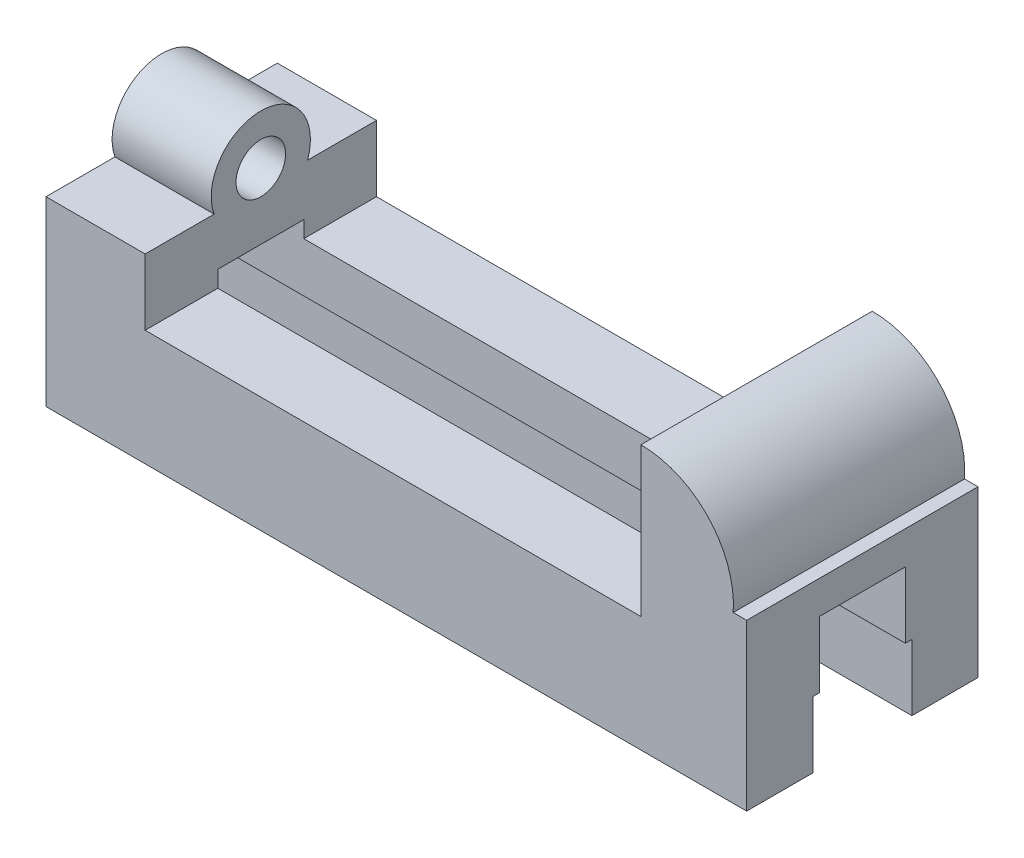
ISO-10303-21;
HEADER;
FILE_DESCRIPTION(('STEP AP214'),'2;1');
FILE_NAME('part.step','',(''),(''),'','','');
FILE_SCHEMA(('AUTOMOTIVE_DESIGN { 1 0 10303 214 1 1 1 1 }'));
ENDSEC;
DATA;
#1=APPLICATION_CONTEXT('core data for automotive mechanical design processes');
#2=APPLICATION_PROTOCOL_DEFINITION('international standard','automotive_design',2000,#1);
#3=PRODUCT_CONTEXT('',#1,'mechanical');
#4=PRODUCT('Part','Part','',(#3));
#5=PRODUCT_RELATED_PRODUCT_CATEGORY('part','',(#4));
#6=PRODUCT_DEFINITION_FORMATION('','',#4);
#7=PRODUCT_DEFINITION_CONTEXT('part definition',#1,'design');
#8=PRODUCT_DEFINITION('design','',#6,#7);
#9=PRODUCT_DEFINITION_SHAPE('','',#8);
#10=(LENGTH_UNIT() NAMED_UNIT(*) SI_UNIT(.MILLI.,.METRE.));
#11=(NAMED_UNIT(*) PLANE_ANGLE_UNIT() SI_UNIT($,.RADIAN.));
#12=(NAMED_UNIT(*) SI_UNIT($,.STERADIAN.) SOLID_ANGLE_UNIT());
#13=UNCERTAINTY_MEASURE_WITH_UNIT(LENGTH_MEASURE(1.E-05),#10,'distance_accuracy_value','');
#14=(GEOMETRIC_REPRESENTATION_CONTEXT(3) GLOBAL_UNCERTAINTY_ASSIGNED_CONTEXT((#13)) GLOBAL_UNIT_ASSIGNED_CONTEXT((#10,
#11,#12)) REPRESENTATION_CONTEXT('',''));
#15=CARTESIAN_POINT('',(0.,0.,0.));
#16=DIRECTION('',(0.,0.,1.));
#17=DIRECTION('',(1.,0.,0.));
#18=AXIS2_PLACEMENT_3D('',#15,#16,#17);
#19=CARTESIAN_POINT('',(-212.,40.,-15.));
#20=DIRECTION('',(1.,0.,0.));
#21=DIRECTION('',(0.,0.,-1.));
#22=AXIS2_PLACEMENT_3D('',#19,#20,#21);
#23=PLANE('',#22);
#24=DIRECTION('',(0.,0.,-1.));
#25=VECTOR('',#24,1.);
#26=CARTESIAN_POINT('',(-212.,-20.,-50.));
#27=LINE('',#26,#25);
#28=CARTESIAN_POINT('',(-212.,-20.,-30.));
#29=VERTEX_POINT('',#28);
#30=CARTESIAN_POINT('',(-212.,-20.,-50.));
#31=VERTEX_POINT('',#30);
#32=EDGE_CURVE('E334',#29,#31,#27,.T.);
#33=ORIENTED_EDGE('',*,*,#32,.F.);
#34=DIRECTION('',(0.,-1.,0.));
#35=VECTOR('',#34,1.);
#36=CARTESIAN_POINT('',(-212.,0.,-30.));
#37=LINE('',#36,#35);
#38=CARTESIAN_POINT('',(-212.,0.,-30.));
#39=VERTEX_POINT('',#38);
#40=EDGE_CURVE('E233',#39,#29,#37,.T.);
#41=ORIENTED_EDGE('',*,*,#40,.F.);
#42=DIRECTION('',(0.,0.,-1.));
#43=VECTOR('',#42,1.);
#44=CARTESIAN_POINT('',(-212.,0.,-28.));
#45=LINE('',#44,#43);
#46=CARTESIAN_POINT('',(-212.,0.,-28.));
#47=VERTEX_POINT('',#46);
#48=EDGE_CURVE('E229',#47,#39,#45,.T.);
#49=ORIENTED_EDGE('',*,*,#48,.F.);
#50=DIRECTION('',(0.,1.,0.));
#51=VECTOR('',#50,1.);
#52=CARTESIAN_POINT('',(-212.,-20.,-28.));
#53=LINE('',#52,#51);
#54=CARTESIAN_POINT('',(-212.,20.,-28.));
#55=VERTEX_POINT('',#54);
#56=EDGE_CURVE('E340',#47,#55,#53,.T.);
#57=ORIENTED_EDGE('',*,*,#56,.T.);
#58=DIRECTION('',(0.,0.,1.));
#59=VECTOR('',#58,1.);
#60=CARTESIAN_POINT('',(-212.,20.,-2.));
#61=LINE('',#60,#59);
#62=CARTESIAN_POINT('',(-212.,20.,-2.));
#63=VERTEX_POINT('',#62);
#64=EDGE_CURVE('E358',#55,#63,#61,.T.);
#65=ORIENTED_EDGE('',*,*,#64,.T.);
#66=DIRECTION('',(0.,-1.,0.));
#67=VECTOR('',#66,1.);
#68=CARTESIAN_POINT('',(-212.,15.,-2.));
#69=LINE('',#68,#67);
#70=CARTESIAN_POINT('',(-212.,0.,-2.));
#71=VERTEX_POINT('',#70);
#72=EDGE_CURVE('E360',#63,#71,#69,.T.);
#73=ORIENTED_EDGE('',*,*,#72,.T.);
#74=DIRECTION('',(0.,0.,-1.));
#75=VECTOR('',#74,1.);
#76=CARTESIAN_POINT('',(-212.,0.,-2.));
#77=LINE('',#76,#75);
#78=CARTESIAN_POINT('',(-212.,0.,0.));
#79=VERTEX_POINT('',#78);
#80=EDGE_CURVE('E250',#79,#71,#77,.T.);
#81=ORIENTED_EDGE('',*,*,#80,.F.);
#82=DIRECTION('',(0.,1.,0.));
#83=VECTOR('',#82,1.);
#84=CARTESIAN_POINT('',(-212.,-20.,0.));
#85=LINE('',#84,#83);
#86=CARTESIAN_POINT('',(-212.,-20.,0.));
#87=VERTEX_POINT('',#86);
#88=EDGE_CURVE('E230',#87,#79,#85,.T.);
#89=ORIENTED_EDGE('',*,*,#88,.F.);
#90=DIRECTION('',(0.,0.,-1.));
#91=VECTOR('',#90,1.);
#92=CARTESIAN_POINT('',(-212.,-20.,0.));
#93=LINE('',#92,#91);
#94=CARTESIAN_POINT('',(-212.,-20.,20.));
#95=VERTEX_POINT('',#94);
#96=EDGE_CURVE('E222',#95,#87,#93,.T.);
#97=ORIENTED_EDGE('',*,*,#96,.F.);
#98=DIRECTION('',(0.,-1.,0.));
#99=VECTOR('',#98,1.);
#100=CARTESIAN_POINT('',(-212.,15.,20.));
#101=LINE('',#100,#99);
#102=CARTESIAN_POINT('',(-212.,35.,20.));
#103=VERTEX_POINT('',#102);
#104=EDGE_CURVE('E331',#103,#95,#101,.T.);
#105=ORIENTED_EDGE('',*,*,#104,.F.);
#106=DIRECTION('',(0.,0.,-1.));
#107=VECTOR('',#106,1.);
#108=CARTESIAN_POINT('',(-212.,35.,-0.857864376269052));
#109=LINE('',#108,#107);
#110=CARTESIAN_POINT('',(-212.,35.,-0.857864376269044));
#111=VERTEX_POINT('',#110);
#112=EDGE_CURVE('E363',#103,#111,#109,.T.);
#113=ORIENTED_EDGE('',*,*,#112,.T.);
#114=CARTESIAN_POINT('',(-212.,40.,-15.));
#115=DIRECTION('',(-1.,0.,0.));
#116=DIRECTION('',(0.,0.,-1.));
#117=AXIS2_PLACEMENT_3D('',#114,#115,#116);
#118=CIRCLE('',#117,15.);
#119=CARTESIAN_POINT('',(-212.,35.,-29.142135623731));
#120=VERTEX_POINT('',#119);
#121=EDGE_CURVE('E365',#111,#120,#118,.T.);
#122=ORIENTED_EDGE('',*,*,#121,.T.);
#123=DIRECTION('',(0.,0.,-1.));
#124=VECTOR('',#123,1.);
#125=CARTESIAN_POINT('',(-212.,35.,-29.9865888344927));
#126=LINE('',#125,#124);
#127=CARTESIAN_POINT('',(-212.,35.,-50.));
#128=VERTEX_POINT('',#127);
#129=EDGE_CURVE('E367',#120,#128,#126,.T.);
#130=ORIENTED_EDGE('',*,*,#129,.T.);
#131=DIRECTION('',(0.,1.,0.));
#132=VECTOR('',#131,1.);
#133=CARTESIAN_POINT('',(-212.,35.,-50.));
#134=LINE('',#133,#132);
#135=EDGE_CURVE('E344',#31,#128,#134,.T.);
#136=ORIENTED_EDGE('',*,*,#135,.F.);
#137=EDGE_LOOP('',(#33,#41,#49,#57,#65,#73,#81,#89,#97,#105,#113,#122,#130,#136));
#138=FACE_BOUND('',#137,.T.);
#139=CARTESIAN_POINT('',(-212.,40.,-15.));
#140=DIRECTION('',(-1.,0.,0.));
#141=DIRECTION('',(0.,0.,1.));
#142=AXIS2_PLACEMENT_3D('',#139,#140,#141);
#143=CIRCLE('',#142,7.49999999999999);
#144=CARTESIAN_POINT('',(-212.,40.,-7.50000000000001));
#145=VERTEX_POINT('',#144);
#146=EDGE_CURVE('E781',#145,#145,#143,.T.);
#147=ORIENTED_EDGE('',*,*,#146,.F.);
#148=EDGE_LOOP('',(#147));
#149=FACE_BOUND('',#148,.T.);
#150=ADVANCED_FACE('F46',(#138,#149),#23,.F.);
#151=CARTESIAN_POINT('',(0.,0.,0.));
#152=DIRECTION('',(0.,1.,0.));
#153=DIRECTION('',(0.,0.,1.));
#154=AXIS2_PLACEMENT_3D('',#151,#152,#153);
#155=PLANE('',#154);
#156=DIRECTION('',(1.,0.,0.));
#157=VECTOR('',#156,1.);
#158=CARTESIAN_POINT('',(0.,0.,0.));
#159=LINE('',#158,#157);
#160=CARTESIAN_POINT('',(0.,0.,0.));
#161=VERTEX_POINT('',#160);
#162=EDGE_CURVE('E226',#79,#161,#159,.T.);
#163=ORIENTED_EDGE('',*,*,#162,.F.);
#164=ORIENTED_EDGE('',*,*,#80,.T.);
#165=DIRECTION('',(1.,0.,0.));
#166=VECTOR('',#165,1.);
#167=CARTESIAN_POINT('',(0.,0.,-2.));
#168=LINE('',#167,#166);
#169=CARTESIAN_POINT('',(0.,0.,-2.));
#170=VERTEX_POINT('',#169);
#171=EDGE_CURVE('E252',#71,#170,#168,.T.);
#172=ORIENTED_EDGE('',*,*,#171,.T.);
#173=DIRECTION('',(0.,0.,1.));
#174=VECTOR('',#173,1.);
#175=CARTESIAN_POINT('',(0.,0.,20.));
#176=LINE('',#175,#174);
#177=EDGE_CURVE('E63',#170,#161,#176,.T.);
#178=ORIENTED_EDGE('',*,*,#177,.T.);
#179=EDGE_LOOP('',(#163,#164,#172,#178));
#180=FACE_BOUND('',#179,.T.);
#181=ADVANCED_FACE('F792',(#180),#155,.F.);
#182=CARTESIAN_POINT('',(0.,20.,0.));
#183=DIRECTION('',(0.,1.,0.));
#184=DIRECTION('',(0.,0.,1.));
#185=AXIS2_PLACEMENT_3D('',#182,#183,#184);
#186=PLANE('',#185);
#187=DIRECTION('',(0.,0.,-1.));
#188=VECTOR('',#187,1.);
#189=CARTESIAN_POINT('',(-182.,20.,-2.));
#190=LINE('',#189,#188);
#191=CARTESIAN_POINT('',(-182.,20.,-2.));
#192=VERTEX_POINT('',#191);
#193=CARTESIAN_POINT('',(-182.,20.,-28.));
#194=VERTEX_POINT('',#193);
#195=EDGE_CURVE('E263',#192,#194,#190,.T.);
#196=ORIENTED_EDGE('',*,*,#195,.F.);
#197=DIRECTION('',(1.,0.,0.));
#198=VECTOR('',#197,1.);
#199=CARTESIAN_POINT('',(-4.00158040597016,20.,-2.));
#200=LINE('',#199,#198);
#201=EDGE_CURVE('E376',#63,#192,#200,.T.);
#202=ORIENTED_EDGE('',*,*,#201,.F.);
#203=ORIENTED_EDGE('',*,*,#64,.F.);
#204=DIRECTION('',(-1.,0.,0.));
#205=VECTOR('',#204,1.);
#206=CARTESIAN_POINT('',(-212.,20.,-28.));
#207=LINE('',#206,#205);
#208=EDGE_CURVE('E333',#194,#55,#207,.T.);
#209=ORIENTED_EDGE('',*,*,#208,.F.);
#210=EDGE_LOOP('',(#196,#202,#203,#209));
#211=FACE_BOUND('',#210,.T.);
#212=ADVANCED_FACE('F798',(#211),#186,.F.);
#213=CARTESIAN_POINT('',(-212.,35.,-0.857864376269052));
#214=DIRECTION('',(0.,-1.,0.));
#215=DIRECTION('',(0.,0.,-1.));
#216=AXIS2_PLACEMENT_3D('',#213,#214,#215);
#217=PLANE('',#216);
#218=DIRECTION('',(0.,0.,1.));
#219=VECTOR('',#218,1.);
#220=CARTESIAN_POINT('',(-182.,35.,-0.857864376269052));
#221=LINE('',#220,#219);
#222=CARTESIAN_POINT('',(-182.,35.,-0.857864376269044));
#223=VERTEX_POINT('',#222);
#224=CARTESIAN_POINT('',(-182.,35.,20.));
#225=VERTEX_POINT('',#224);
#226=EDGE_CURVE('E278',#223,#225,#221,.T.);
#227=ORIENTED_EDGE('',*,*,#226,.F.);
#228=DIRECTION('',(1.,0.,0.));
#229=VECTOR('',#228,1.);
#230=CARTESIAN_POINT('',(-212.,35.,-0.857864376269044));
#231=LINE('',#230,#229);
#232=EDGE_CURVE('E372',#111,#223,#231,.T.);
#233=ORIENTED_EDGE('',*,*,#232,.F.);
#234=ORIENTED_EDGE('',*,*,#112,.F.);
#235=DIRECTION('',(-1.,0.,0.));
#236=VECTOR('',#235,1.);
#237=CARTESIAN_POINT('',(-212.,35.,20.));
#238=LINE('',#237,#236);
#239=EDGE_CURVE('E329',#225,#103,#238,.T.);
#240=ORIENTED_EDGE('',*,*,#239,.F.);
#241=EDGE_LOOP('',(#227,#233,#234,#240));
#242=FACE_BOUND('',#241,.T.);
#243=ADVANCED_FACE('F811',(#242),#217,.F.);
#244=CARTESIAN_POINT('',(-212.,40.,-15.));
#245=DIRECTION('',(1.,0.,0.));
#246=DIRECTION('',(0.,0.,-1.));
#247=AXIS2_PLACEMENT_3D('',#244,#245,#246);
#248=CYLINDRICAL_SURFACE('',#247,15.);
#249=CARTESIAN_POINT('',(-182.,40.,-15.));
#250=DIRECTION('',(1.,0.,0.));
#251=DIRECTION('',(0.,0.,-1.));
#252=AXIS2_PLACEMENT_3D('',#249,#250,#251);
#253=CIRCLE('',#252,15.);
#254=CARTESIAN_POINT('',(-182.,35.,-29.142135623731));
#255=VERTEX_POINT('',#254);
#256=EDGE_CURVE('E276',#255,#223,#253,.T.);
#257=ORIENTED_EDGE('',*,*,#256,.F.);
#258=DIRECTION('',(1.,0.,0.));
#259=VECTOR('',#258,1.);
#260=CARTESIAN_POINT('',(-212.,35.,-29.142135623731));
#261=LINE('',#260,#259);
#262=EDGE_CURVE('E369',#120,#255,#261,.T.);
#263=ORIENTED_EDGE('',*,*,#262,.F.);
#264=ORIENTED_EDGE('',*,*,#121,.F.);
#265=ORIENTED_EDGE('',*,*,#232,.T.);
#266=EDGE_LOOP('',(#257,#263,#264,#265));
#267=FACE_BOUND('',#266,.T.);
#268=ADVANCED_FACE('F807',(#267),#248,.T.);
#269=CARTESIAN_POINT('',(-212.,35.,-29.9865888344927));
#270=DIRECTION('',(0.,-1.,0.));
#271=DIRECTION('',(0.,0.,-1.));
#272=AXIS2_PLACEMENT_3D('',#269,#270,#271);
#273=PLANE('',#272);
#274=DIRECTION('',(0.,0.,1.));
#275=VECTOR('',#274,1.);
#276=CARTESIAN_POINT('',(-182.,35.,-50.));
#277=LINE('',#276,#275);
#278=CARTESIAN_POINT('',(-182.,35.,-50.));
#279=VERTEX_POINT('',#278);
#280=EDGE_CURVE('E274',#279,#255,#277,.T.);
#281=ORIENTED_EDGE('',*,*,#280,.F.);
#282=DIRECTION('',(1.,0.,0.));
#283=VECTOR('',#282,1.);
#284=CARTESIAN_POINT('',(-32.,35.,-50.));
#285=LINE('',#284,#283);
#286=EDGE_CURVE('E347',#128,#279,#285,.T.);
#287=ORIENTED_EDGE('',*,*,#286,.F.);
#288=ORIENTED_EDGE('',*,*,#129,.F.);
#289=ORIENTED_EDGE('',*,*,#262,.T.);
#290=EDGE_LOOP('',(#281,#287,#288,#289));
#291=FACE_BOUND('',#290,.T.);
#292=ADVANCED_FACE('F804',(#291),#273,.F.);
#293=CARTESIAN_POINT('',(-32.,32.,-50.));
#294=DIRECTION('',(0.,0.,1.));
#295=DIRECTION('',(0.,-1.,0.));
#296=AXIS2_PLACEMENT_3D('',#293,#294,#295);
#297=PLANE('',#296);
#298=DIRECTION('',(0.,1.,0.));
#299=VECTOR('',#298,1.);
#300=CARTESIAN_POINT('',(-182.,15.,-50.));
#301=LINE('',#300,#299);
#302=CARTESIAN_POINT('',(-182.,15.,-50.));
#303=VERTEX_POINT('',#302);
#304=EDGE_CURVE('E272',#303,#279,#301,.T.);
#305=ORIENTED_EDGE('',*,*,#304,.F.);
#306=DIRECTION('',(1.,0.,0.));
#307=VECTOR('',#306,1.);
#308=CARTESIAN_POINT('',(-182.,15.,-50.));
#309=LINE('',#308,#307);
#310=CARTESIAN_POINT('',(-32.,15.,-50.));
#311=VERTEX_POINT('',#310);
#312=EDGE_CURVE('E299',#303,#311,#309,.T.);
#313=ORIENTED_EDGE('',*,*,#312,.T.);
#314=DIRECTION('',(0.,1.,0.));
#315=VECTOR('',#314,1.);
#316=CARTESIAN_POINT('',(-32.,60.,-50.));
#317=LINE('',#316,#315);
#318=CARTESIAN_POINT('',(-32.,60.,-50.));
#319=VERTEX_POINT('',#318);
#320=EDGE_CURVE('E350',#311,#319,#317,.T.);
#321=ORIENTED_EDGE('',*,*,#320,.T.);
#322=CARTESIAN_POINT('',(-32.,32.,-50.));
#323=DIRECTION('',(0.,0.,-1.));
#324=DIRECTION('',(0.,-1.,0.));
#325=AXIS2_PLACEMENT_3D('',#322,#323,#324);
#326=CIRCLE('',#325,28.);
#327=CARTESIAN_POINT('',(-4.07151991246211,30.,-50.));
#328=VERTEX_POINT('',#327);
#329=EDGE_CURVE('E353',#319,#328,#326,.T.);
#330=ORIENTED_EDGE('',*,*,#329,.T.);
#331=DIRECTION('',(1.,0.,0.));
#332=VECTOR('',#331,1.);
#333=CARTESIAN_POINT('',(-4.00158040597016,30.,-50.));
#334=LINE('',#333,#332);
#335=CARTESIAN_POINT('',(0.,30.,-50.));
#336=VERTEX_POINT('',#335);
#337=EDGE_CURVE('E356',#328,#336,#334,.T.);
#338=ORIENTED_EDGE('',*,*,#337,.T.);
#339=DIRECTION('',(0.,1.,0.));
#340=VECTOR('',#339,1.);
#341=CARTESIAN_POINT('',(0.,30.,-50.));
#342=LINE('',#341,#340);
#343=CARTESIAN_POINT('',(0.,-20.,-50.));
#344=VERTEX_POINT('',#343);
#345=EDGE_CURVE('E314',#344,#336,#342,.T.);
#346=ORIENTED_EDGE('',*,*,#345,.F.);
#347=DIRECTION('',(1.,0.,0.));
#348=VECTOR('',#347,1.);
#349=CARTESIAN_POINT('',(-4.00158040597016,-20.,-50.));
#350=LINE('',#349,#348);
#351=EDGE_CURVE('E336',#31,#344,#350,.T.);
#352=ORIENTED_EDGE('',*,*,#351,.F.);
#353=ORIENTED_EDGE('',*,*,#135,.T.);
#354=ORIENTED_EDGE('',*,*,#286,.T.);
#355=EDGE_LOOP('',(#305,#313,#321,#330,#338,#346,#352,#353,#354));
#356=FACE_BOUND('',#355,.T.);
#357=ADVANCED_FACE('F768',(#356),#297,.F.);
#358=CARTESIAN_POINT('',(-212.,-20.,-28.));
#359=DIRECTION('',(0.,0.,-1.));
#360=DIRECTION('',(0.,1.,0.));
#361=AXIS2_PLACEMENT_3D('',#358,#359,#360);
#362=PLANE('',#361);
#363=ORIENTED_EDGE('',*,*,#56,.F.);
#364=DIRECTION('',(-1.,0.,0.));
#365=VECTOR('',#364,1.);
#366=CARTESIAN_POINT('',(0.,0.,-28.));
#367=LINE('',#366,#365);
#368=CARTESIAN_POINT('',(0.,0.,-28.));
#369=VERTEX_POINT('',#368);
#370=EDGE_CURVE('E240',#369,#47,#367,.T.);
#371=ORIENTED_EDGE('',*,*,#370,.F.);
#372=DIRECTION('',(0.,-1.,0.));
#373=VECTOR('',#372,1.);
#374=CARTESIAN_POINT('',(0.,-20.,-28.));
#375=LINE('',#374,#373);
#376=CARTESIAN_POINT('',(0.,20.,-28.));
#377=VERTEX_POINT('',#376);
#378=EDGE_CURVE('E309',#377,#369,#375,.T.);
#379=ORIENTED_EDGE('',*,*,#378,.F.);
#380=CARTESIAN_POINT('',(-32.,20.,-28.));
#381=VERTEX_POINT('',#380);
#382=EDGE_CURVE('E337',#377,#381,#207,.T.);
#383=ORIENTED_EDGE('',*,*,#382,.T.);
#384=DIRECTION('',(0.,-1.,0.));
#385=VECTOR('',#384,1.);
#386=CARTESIAN_POINT('',(-32.,20.,-28.));
#387=LINE('',#386,#385);
#388=CARTESIAN_POINT('',(-32.,15.,-28.));
#389=VERTEX_POINT('',#388);
#390=EDGE_CURVE('E292',#381,#389,#387,.T.);
#391=ORIENTED_EDGE('',*,*,#390,.T.);
#392=DIRECTION('',(1.,0.,0.));
#393=VECTOR('',#392,1.);
#394=CARTESIAN_POINT('',(-182.,15.,-28.));
#395=LINE('',#394,#393);
#396=CARTESIAN_POINT('',(-182.,15.,-28.));
#397=VERTEX_POINT('',#396);
#398=EDGE_CURVE('E286',#397,#389,#395,.T.);
#399=ORIENTED_EDGE('',*,*,#398,.F.);
#400=DIRECTION('',(0.,-1.,0.));
#401=VECTOR('',#400,1.);
#402=CARTESIAN_POINT('',(-182.,20.,-28.));
#403=LINE('',#402,#401);
#404=EDGE_CURVE('E266',#194,#397,#403,.T.);
#405=ORIENTED_EDGE('',*,*,#404,.F.);
#406=ORIENTED_EDGE('',*,*,#208,.T.);
#407=EDGE_LOOP('',(#363,#371,#379,#383,#391,#399,#405,#406));
#408=FACE_BOUND('',#407,.T.);
#409=ADVANCED_FACE('F824',(#408),#362,.F.);
#410=CARTESIAN_POINT('',(-32.,20.,-2.));
#411=VERTEX_POINT('',#410);
#412=CARTESIAN_POINT('',(0.,20.,-2.));
#413=VERTEX_POINT('',#412);
#414=EDGE_CURVE('E375',#411,#413,#200,.T.);
#415=ORIENTED_EDGE('',*,*,#414,.F.);
#416=DIRECTION('',(0.,0.,-1.));
#417=VECTOR('',#416,1.);
#418=CARTESIAN_POINT('',(-32.,20.,-2.));
#419=LINE('',#418,#417);
#420=EDGE_CURVE('E289',#411,#381,#419,.T.);
#421=ORIENTED_EDGE('',*,*,#420,.T.);
#422=ORIENTED_EDGE('',*,*,#382,.F.);
#423=DIRECTION('',(0.,0.,-1.));
#424=VECTOR('',#423,1.);
#425=CARTESIAN_POINT('',(0.,20.,-28.));
#426=LINE('',#425,#424);
#427=EDGE_CURVE('E306',#413,#377,#426,.T.);
#428=ORIENTED_EDGE('',*,*,#427,.F.);
#429=EDGE_LOOP('',(#415,#421,#422,#428));
#430=FACE_BOUND('',#429,.T.);
#431=ADVANCED_FACE('F821',(#430),#186,.F.);
#432=CARTESIAN_POINT('',(-32.,0.,0.));
#433=DIRECTION('',(1.,0.,0.));
#434=DIRECTION('',(0.,1.,0.));
#435=AXIS2_PLACEMENT_3D('',#432,#433,#434);
#436=PLANE('',#435);
#437=ORIENTED_EDGE('',*,*,#320,.F.);
#438=DIRECTION('',(0.,0.,-1.));
#439=VECTOR('',#438,1.);
#440=CARTESIAN_POINT('',(-32.,15.,-28.));
#441=LINE('',#440,#439);
#442=EDGE_CURVE('E295',#389,#311,#441,.T.);
#443=ORIENTED_EDGE('',*,*,#442,.F.);
#444=ORIENTED_EDGE('',*,*,#390,.F.);
#445=ORIENTED_EDGE('',*,*,#420,.F.);
#446=DIRECTION('',(0.,1.,0.));
#447=VECTOR('',#446,1.);
#448=CARTESIAN_POINT('',(-32.,15.,-2.));
#449=LINE('',#448,#447);
#450=CARTESIAN_POINT('',(-32.,15.,-2.));
#451=VERTEX_POINT('',#450);
#452=EDGE_CURVE('E256',#451,#411,#449,.T.);
#453=ORIENTED_EDGE('',*,*,#452,.F.);
#454=DIRECTION('',(0.,0.,-1.));
#455=VECTOR('',#454,1.);
#456=CARTESIAN_POINT('',(-32.,15.,20.));
#457=LINE('',#456,#455);
#458=CARTESIAN_POINT('',(-32.,15.,20.));
#459=VERTEX_POINT('',#458);
#460=EDGE_CURVE('E264',#459,#451,#457,.T.);
#461=ORIENTED_EDGE('',*,*,#460,.F.);
#462=DIRECTION('',(0.,-1.,0.));
#463=VECTOR('',#462,1.);
#464=CARTESIAN_POINT('',(-32.,35.,20.));
#465=LINE('',#464,#463);
#466=CARTESIAN_POINT('',(-32.,60.,20.));
#467=VERTEX_POINT('',#466);
#468=EDGE_CURVE('E326',#467,#459,#465,.T.);
#469=ORIENTED_EDGE('',*,*,#468,.F.);
#470=DIRECTION('',(0.,0.,-1.));
#471=VECTOR('',#470,1.);
#472=CARTESIAN_POINT('',(-32.,60.,20.));
#473=LINE('',#472,#471);
#474=EDGE_CURVE('E56',#467,#319,#473,.T.);
#475=ORIENTED_EDGE('',*,*,#474,.T.);
#476=EDGE_LOOP('',(#437,#443,#444,#445,#453,#461,#469,#475));
#477=FACE_BOUND('',#476,.T.);
#478=ADVANCED_FACE('F48',(#477),#436,.F.);
#479=CARTESIAN_POINT('',(-32.,32.,20.));
#480=DIRECTION('',(0.,0.,-1.));
#481=DIRECTION('',(0.,1.,0.));
#482=AXIS2_PLACEMENT_3D('',#479,#480,#481);
#483=CYLINDRICAL_SURFACE('',#482,28.);
#484=DIRECTION('',(0.,0.,-1.));
#485=VECTOR('',#484,1.);
#486=CARTESIAN_POINT('',(-4.07151991246211,30.,20.));
#487=LINE('',#486,#485);
#488=CARTESIAN_POINT('',(-4.07151991246212,30.,20.));
#489=VERTEX_POINT('',#488);
#490=EDGE_CURVE('E12',#489,#328,#487,.T.);
#491=ORIENTED_EDGE('',*,*,#490,.T.);
#492=ORIENTED_EDGE('',*,*,#329,.F.);
#493=ORIENTED_EDGE('',*,*,#474,.F.);
#494=CARTESIAN_POINT('',(-32.,32.,20.));
#495=DIRECTION('',(0.,0.,1.));
#496=DIRECTION('',(-1.,0.,0.));
#497=AXIS2_PLACEMENT_3D('',#494,#495,#496);
#498=CIRCLE('',#497,28.);
#499=EDGE_CURVE('E323',#489,#467,#498,.T.);
#500=ORIENTED_EDGE('',*,*,#499,.F.);
#501=EDGE_LOOP('',(#491,#492,#493,#500));
#502=FACE_BOUND('',#501,.T.);
#503=ADVANCED_FACE('F770',(#502),#483,.T.);
#504=CARTESIAN_POINT('',(0.,30.,0.));
#505=DIRECTION('',(0.,1.,0.));
#506=DIRECTION('',(0.,0.,1.));
#507=AXIS2_PLACEMENT_3D('',#504,#505,#506);
#508=PLANE('',#507);
#509=ORIENTED_EDGE('',*,*,#490,.F.);
#510=DIRECTION('',(-1.,0.,0.));
#511=VECTOR('',#510,1.);
#512=CARTESIAN_POINT('',(-4.07151991246211,30.,20.));
#513=LINE('',#512,#511);
#514=CARTESIAN_POINT('',(0.,30.,20.));
#515=VERTEX_POINT('',#514);
#516=EDGE_CURVE('E320',#515,#489,#513,.T.);
#517=ORIENTED_EDGE('',*,*,#516,.F.);
#518=DIRECTION('',(0.,0.,1.));
#519=VECTOR('',#518,1.);
#520=CARTESIAN_POINT('',(0.,30.,20.));
#521=LINE('',#520,#519);
#522=EDGE_CURVE('E317',#336,#515,#521,.T.);
#523=ORIENTED_EDGE('',*,*,#522,.F.);
#524=ORIENTED_EDGE('',*,*,#337,.F.);
#525=EDGE_LOOP('',(#509,#517,#523,#524));
#526=FACE_BOUND('',#525,.T.);
#527=ADVANCED_FACE('F772',(#526),#508,.T.);
#528=CARTESIAN_POINT('',(-4.00158040597016,15.,-2.));
#529=DIRECTION('',(0.,0.,1.));
#530=DIRECTION('',(0.,-1.,0.));
#531=AXIS2_PLACEMENT_3D('',#528,#529,#530);
#532=PLANE('',#531);
#533=DIRECTION('',(0.,1.,0.));
#534=VECTOR('',#533,1.);
#535=CARTESIAN_POINT('',(0.,20.,-2.));
#536=LINE('',#535,#534);
#537=EDGE_CURVE('E302',#170,#413,#536,.T.);
#538=ORIENTED_EDGE('',*,*,#537,.F.);
#539=ORIENTED_EDGE('',*,*,#171,.F.);
#540=ORIENTED_EDGE('',*,*,#72,.F.);
#541=ORIENTED_EDGE('',*,*,#201,.T.);
#542=DIRECTION('',(0.,1.,0.));
#543=VECTOR('',#542,1.);
#544=CARTESIAN_POINT('',(-182.,15.,-2.));
#545=LINE('',#544,#543);
#546=CARTESIAN_POINT('',(-182.,15.,-2.));
#547=VERTEX_POINT('',#546);
#548=EDGE_CURVE('E261',#547,#192,#545,.T.);
#549=ORIENTED_EDGE('',*,*,#548,.F.);
#550=DIRECTION('',(1.,0.,0.));
#551=VECTOR('',#550,1.);
#552=CARTESIAN_POINT('',(0.,15.,-2.));
#553=LINE('',#552,#551);
#554=EDGE_CURVE('E253',#547,#451,#553,.T.);
#555=ORIENTED_EDGE('',*,*,#554,.T.);
#556=ORIENTED_EDGE('',*,*,#452,.T.);
#557=ORIENTED_EDGE('',*,*,#414,.T.);
#558=EDGE_LOOP('',(#538,#539,#540,#541,#549,#555,#556,#557));
#559=FACE_BOUND('',#558,.T.);
#560=ADVANCED_FACE('F816',(#559),#532,.F.);
#561=CARTESIAN_POINT('',(0.,-20.,0.));
#562=DIRECTION('',(0.,1.,0.));
#563=DIRECTION('',(0.,0.,1.));
#564=AXIS2_PLACEMENT_3D('',#561,#562,#563);
#565=PLANE('',#564);
#566=DIRECTION('',(0.,0.,-1.));
#567=VECTOR('',#566,1.);
#568=CARTESIAN_POINT('',(0.,-20.,-50.));
#569=LINE('',#568,#567);
#570=CARTESIAN_POINT('',(0.,-20.,-30.));
#571=VERTEX_POINT('',#570);
#572=EDGE_CURVE('E312',#571,#344,#569,.T.);
#573=ORIENTED_EDGE('',*,*,#572,.F.);
#574=DIRECTION('',(-1.,0.,0.));
#575=VECTOR('',#574,1.);
#576=CARTESIAN_POINT('',(0.,-20.,-30.));
#577=LINE('',#576,#575);
#578=EDGE_CURVE('E243',#571,#29,#577,.T.);
#579=ORIENTED_EDGE('',*,*,#578,.T.);
#580=ORIENTED_EDGE('',*,*,#32,.T.);
#581=ORIENTED_EDGE('',*,*,#351,.T.);
#582=EDGE_LOOP('',(#573,#579,#580,#581));
#583=FACE_BOUND('',#582,.T.);
#584=ADVANCED_FACE('F819',(#583),#565,.F.);
#585=CARTESIAN_POINT('',(-32.,32.,20.));
#586=DIRECTION('',(0.,0.,-1.));
#587=DIRECTION('',(-1.,0.,0.));
#588=AXIS2_PLACEMENT_3D('',#585,#586,#587);
#589=PLANE('',#588);
#590=ORIENTED_EDGE('',*,*,#468,.T.);
#591=DIRECTION('',(-1.,0.,0.));
#592=VECTOR('',#591,1.);
#593=CARTESIAN_POINT('',(-212.,15.,20.));
#594=LINE('',#593,#592);
#595=CARTESIAN_POINT('',(-182.,15.,20.));
#596=VERTEX_POINT('',#595);
#597=EDGE_CURVE('E246',#459,#596,#594,.T.);
#598=ORIENTED_EDGE('',*,*,#597,.T.);
#599=DIRECTION('',(0.,-1.,0.));
#600=VECTOR('',#599,1.);
#601=CARTESIAN_POINT('',(-182.,35.,20.));
#602=LINE('',#601,#600);
#603=EDGE_CURVE('E280',#225,#596,#602,.T.);
#604=ORIENTED_EDGE('',*,*,#603,.F.);
#605=ORIENTED_EDGE('',*,*,#239,.T.);
#606=ORIENTED_EDGE('',*,*,#104,.T.);
#607=DIRECTION('',(-1.,0.,0.));
#608=VECTOR('',#607,1.);
#609=CARTESIAN_POINT('',(-212.,-20.,20.));
#610=LINE('',#609,#608);
#611=CARTESIAN_POINT('',(0.,-20.,20.));
#612=VERTEX_POINT('',#611);
#613=EDGE_CURVE('E216',#612,#95,#610,.T.);
#614=ORIENTED_EDGE('',*,*,#613,.F.);
#615=DIRECTION('',(0.,-1.,0.));
#616=VECTOR('',#615,1.);
#617=CARTESIAN_POINT('',(0.,15.,20.));
#618=LINE('',#617,#616);
#619=EDGE_CURVE('E212',#515,#612,#618,.T.);
#620=ORIENTED_EDGE('',*,*,#619,.F.);
#621=ORIENTED_EDGE('',*,*,#516,.T.);
#622=ORIENTED_EDGE('',*,*,#499,.T.);
#623=EDGE_LOOP('',(#590,#598,#604,#605,#606,#614,#620,#621,#622));
#624=FACE_BOUND('',#623,.T.);
#625=ADVANCED_FACE('F775',(#624),#589,.F.);
#626=CARTESIAN_POINT('',(0.,0.,0.));
#627=DIRECTION('',(-1.,0.,0.));
#628=DIRECTION('',(0.,0.,1.));
#629=AXIS2_PLACEMENT_3D('',#626,#627,#628);
#630=PLANE('',#629);
#631=DIRECTION('',(0.,0.,-1.));
#632=VECTOR('',#631,1.);
#633=CARTESIAN_POINT('',(0.,0.,-28.));
#634=LINE('',#633,#632);
#635=CARTESIAN_POINT('',(0.,0.,-30.));
#636=VERTEX_POINT('',#635);
#637=EDGE_CURVE('E238',#369,#636,#634,.T.);
#638=ORIENTED_EDGE('',*,*,#637,.T.);
#639=DIRECTION('',(0.,-1.,0.));
#640=VECTOR('',#639,1.);
#641=CARTESIAN_POINT('',(0.,0.,-30.));
#642=LINE('',#641,#640);
#643=EDGE_CURVE('E71',#636,#571,#642,.T.);
#644=ORIENTED_EDGE('',*,*,#643,.T.);
#645=ORIENTED_EDGE('',*,*,#572,.T.);
#646=ORIENTED_EDGE('',*,*,#345,.T.);
#647=ORIENTED_EDGE('',*,*,#522,.T.);
#648=ORIENTED_EDGE('',*,*,#619,.T.);
#649=DIRECTION('',(0.,0.,1.));
#650=VECTOR('',#649,1.);
#651=CARTESIAN_POINT('',(0.,-20.,20.));
#652=LINE('',#651,#650);
#653=CARTESIAN_POINT('',(0.,-20.,0.));
#654=VERTEX_POINT('',#653);
#655=EDGE_CURVE('E203',#654,#612,#652,.T.);
#656=ORIENTED_EDGE('',*,*,#655,.F.);
#657=DIRECTION('',(0.,1.,0.));
#658=VECTOR('',#657,1.);
#659=CARTESIAN_POINT('',(0.,-20.,0.));
#660=LINE('',#659,#658);
#661=EDGE_CURVE('E208',#654,#161,#660,.T.);
#662=ORIENTED_EDGE('',*,*,#661,.T.);
#663=ORIENTED_EDGE('',*,*,#177,.F.);
#664=ORIENTED_EDGE('',*,*,#537,.T.);
#665=ORIENTED_EDGE('',*,*,#427,.T.);
#666=ORIENTED_EDGE('',*,*,#378,.T.);
#667=EDGE_LOOP('',(#638,#644,#645,#646,#647,#648,#656,#662,#663,#664,#665,#666));
#668=FACE_BOUND('',#667,.T.);
#669=ADVANCED_FACE('F206',(#668),#630,.F.);
#670=CARTESIAN_POINT('',(-182.,15.,-28.));
#671=DIRECTION('',(0.,-1.,0.));
#672=DIRECTION('',(0.,0.,-1.));
#673=AXIS2_PLACEMENT_3D('',#670,#671,#672);
#674=PLANE('',#673);
#675=ORIENTED_EDGE('',*,*,#442,.T.);
#676=ORIENTED_EDGE('',*,*,#312,.F.);
#677=DIRECTION('',(0.,0.,-1.));
#678=VECTOR('',#677,1.);
#679=CARTESIAN_POINT('',(-182.,15.,-28.));
#680=LINE('',#679,#678);
#681=EDGE_CURVE('E269',#397,#303,#680,.T.);
#682=ORIENTED_EDGE('',*,*,#681,.F.);
#683=ORIENTED_EDGE('',*,*,#398,.T.);
#684=EDGE_LOOP('',(#675,#676,#682,#683));
#685=FACE_BOUND('',#684,.T.);
#686=ADVANCED_FACE('F900',(#685),#674,.F.);
#687=CARTESIAN_POINT('',(-182.,40.,-15.));
#688=DIRECTION('',(1.,0.,0.));
#689=DIRECTION('',(0.,0.,-1.));
#690=AXIS2_PLACEMENT_3D('',#687,#688,#689);
#691=PLANE('',#690);
#692=CARTESIAN_POINT('',(-182.,40.,-15.));
#693=DIRECTION('',(1.,0.,0.));
#694=DIRECTION('',(0.,0.,-1.));
#695=AXIS2_PLACEMENT_3D('',#692,#693,#694);
#696=CIRCLE('',#695,7.49999999999999);
#697=CARTESIAN_POINT('',(-182.,40.,-22.5));
#698=VERTEX_POINT('',#697);
#699=EDGE_CURVE('E779',#698,#698,#696,.T.);
#700=ORIENTED_EDGE('',*,*,#699,.F.);
#701=EDGE_LOOP('',(#700));
#702=FACE_BOUND('',#701,.T.);
#703=ORIENTED_EDGE('',*,*,#548,.T.);
#704=ORIENTED_EDGE('',*,*,#195,.T.);
#705=ORIENTED_EDGE('',*,*,#404,.T.);
#706=ORIENTED_EDGE('',*,*,#681,.T.);
#707=ORIENTED_EDGE('',*,*,#304,.T.);
#708=ORIENTED_EDGE('',*,*,#280,.T.);
#709=ORIENTED_EDGE('',*,*,#256,.T.);
#710=ORIENTED_EDGE('',*,*,#226,.T.);
#711=ORIENTED_EDGE('',*,*,#603,.T.);
#712=DIRECTION('',(0.,0.,-1.));
#713=VECTOR('',#712,1.);
#714=CARTESIAN_POINT('',(-182.,15.,20.));
#715=LINE('',#714,#713);
#716=EDGE_CURVE('E283',#596,#547,#715,.T.);
#717=ORIENTED_EDGE('',*,*,#716,.T.);
#718=EDGE_LOOP('',(#703,#704,#705,#706,#707,#708,#709,#710,#711,#717));
#719=FACE_BOUND('',#718,.T.);
#720=ADVANCED_FACE('F931',(#702,#719),#691,.T.);
#721=CARTESIAN_POINT('',(0.,15.,0.));
#722=DIRECTION('',(0.,1.,0.));
#723=DIRECTION('',(0.,0.,1.));
#724=AXIS2_PLACEMENT_3D('',#721,#722,#723);
#725=PLANE('',#724);
#726=ORIENTED_EDGE('',*,*,#460,.T.);
#727=ORIENTED_EDGE('',*,*,#554,.F.);
#728=ORIENTED_EDGE('',*,*,#716,.F.);
#729=ORIENTED_EDGE('',*,*,#597,.F.);
#730=EDGE_LOOP('',(#726,#727,#728,#729));
#731=FACE_BOUND('',#730,.T.);
#732=ADVANCED_FACE('F936',(#731),#725,.T.);
#733=CARTESIAN_POINT('',(0.,0.,-30.));
#734=DIRECTION('',(0.,0.,-1.));
#735=DIRECTION('',(-1.,0.,0.));
#736=AXIS2_PLACEMENT_3D('',#733,#734,#735);
#737=PLANE('',#736);
#738=ORIENTED_EDGE('',*,*,#40,.T.);
#739=ORIENTED_EDGE('',*,*,#578,.F.);
#740=ORIENTED_EDGE('',*,*,#643,.F.);
#741=DIRECTION('',(-1.,0.,0.));
#742=VECTOR('',#741,1.);
#743=CARTESIAN_POINT('',(0.,0.,-30.));
#744=LINE('',#743,#742);
#745=EDGE_CURVE('E247',#636,#39,#744,.T.);
#746=ORIENTED_EDGE('',*,*,#745,.T.);
#747=EDGE_LOOP('',(#738,#739,#740,#746));
#748=FACE_BOUND('',#747,.T.);
#749=ADVANCED_FACE('F951',(#748),#737,.F.);
#750=CARTESIAN_POINT('',(0.,0.,-28.));
#751=DIRECTION('',(0.,1.,0.));
#752=DIRECTION('',(0.,0.,1.));
#753=AXIS2_PLACEMENT_3D('',#750,#751,#752);
#754=PLANE('',#753);
#755=ORIENTED_EDGE('',*,*,#48,.T.);
#756=ORIENTED_EDGE('',*,*,#745,.F.);
#757=ORIENTED_EDGE('',*,*,#637,.F.);
#758=ORIENTED_EDGE('',*,*,#370,.T.);
#759=EDGE_LOOP('',(#755,#756,#757,#758));
#760=FACE_BOUND('',#759,.T.);
#761=ADVANCED_FACE('F883',(#760),#754,.F.);
#762=CARTESIAN_POINT('',(0.,-20.,0.));
#763=DIRECTION('',(0.,0.,1.));
#764=DIRECTION('',(1.,0.,0.));
#765=AXIS2_PLACEMENT_3D('',#762,#763,#764);
#766=PLANE('',#765);
#767=ORIENTED_EDGE('',*,*,#162,.T.);
#768=ORIENTED_EDGE('',*,*,#661,.F.);
#769=DIRECTION('',(1.,0.,0.));
#770=VECTOR('',#769,1.);
#771=CARTESIAN_POINT('',(0.,-20.,0.));
#772=LINE('',#771,#770);
#773=EDGE_CURVE('E217',#87,#654,#772,.T.);
#774=ORIENTED_EDGE('',*,*,#773,.F.);
#775=ORIENTED_EDGE('',*,*,#88,.T.);
#776=EDGE_LOOP('',(#767,#768,#774,#775));
#777=FACE_BOUND('',#776,.T.);
#778=ADVANCED_FACE('F228',(#777),#766,.F.);
#779=CARTESIAN_POINT('',(0.,-20.,0.));
#780=DIRECTION('',(0.,1.,0.));
#781=DIRECTION('',(0.,0.,1.));
#782=AXIS2_PLACEMENT_3D('',#779,#780,#781);
#783=PLANE('',#782);
#784=ORIENTED_EDGE('',*,*,#773,.T.);
#785=ORIENTED_EDGE('',*,*,#655,.T.);
#786=ORIENTED_EDGE('',*,*,#613,.T.);
#787=ORIENTED_EDGE('',*,*,#96,.T.);
#788=EDGE_LOOP('',(#784,#785,#786,#787));
#789=FACE_BOUND('',#788,.T.);
#790=ADVANCED_FACE('F220',(#789),#783,.F.);
#791=CARTESIAN_POINT('',(-212.,40.,-15.));
#792=DIRECTION('',(-1.,0.,0.));
#793=DIRECTION('',(0.,0.,1.));
#794=AXIS2_PLACEMENT_3D('',#791,#792,#793);
#795=CYLINDRICAL_SURFACE('',#794,7.49999999999999);
#796=ORIENTED_EDGE('',*,*,#146,.T.);
#797=EDGE_LOOP('',(#796));
#798=FACE_BOUND('',#797,.T.);
#799=ORIENTED_EDGE('',*,*,#699,.T.);
#800=EDGE_LOOP('',(#799));
#801=FACE_BOUND('',#800,.T.);
#802=ADVANCED_FACE('F789',(#798,#801),#795,.F.);
#803=CLOSED_SHELL('',(#150,#181,#212,#243,#268,#292,#357,#409,#431,#478,#503,#527,#560,#584,
#625,#669,#686,#720,#732,#749,#761,#778,#790,#802));
#804=MANIFOLD_SOLID_BREP('B2',#803);
#805=ADVANCED_BREP_SHAPE_REPRESENTATION('',(#18,#804),#14);
#806=SHAPE_DEFINITION_REPRESENTATION(#9,#805);
ENDSEC;
END-ISO-10303-21;
